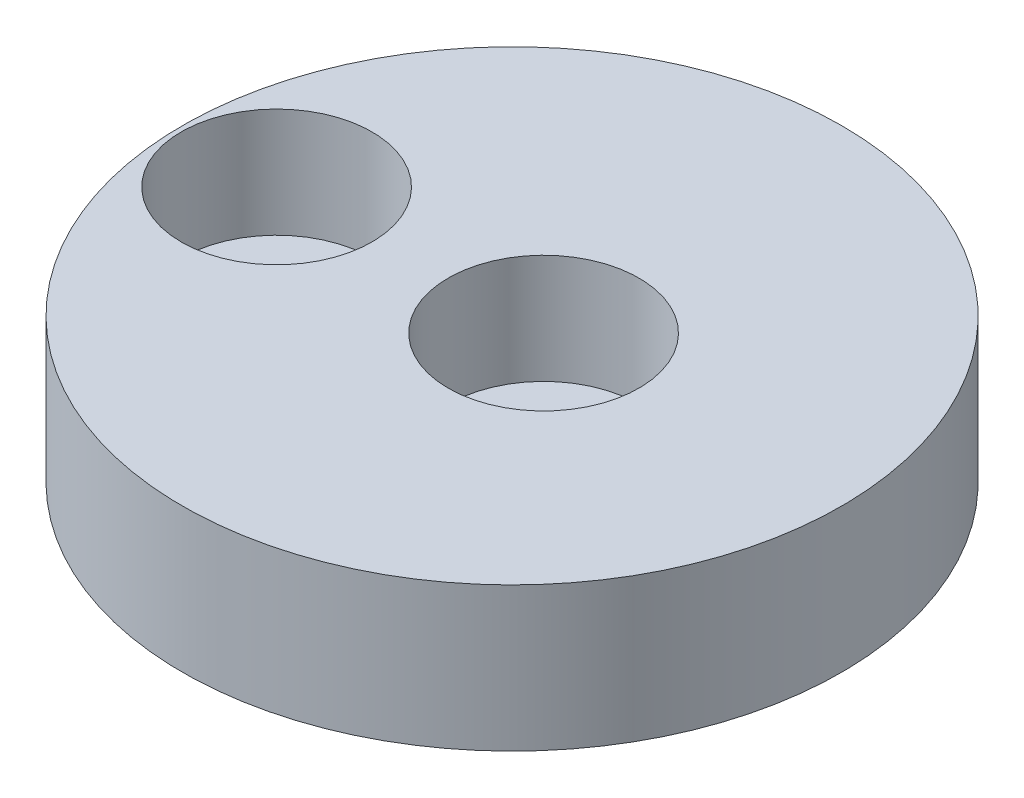
ISO-10303-21;
HEADER;
FILE_DESCRIPTION(('STEP AP214'),'2;1');
FILE_NAME('part.step','',(''),(''),'','','');
FILE_SCHEMA(('AUTOMOTIVE_DESIGN { 1 0 10303 214 1 1 1 1 }'));
ENDSEC;
DATA;
#1=APPLICATION_CONTEXT('core data for automotive mechanical design processes');
#2=APPLICATION_PROTOCOL_DEFINITION('international standard','automotive_design',2000,#1);
#3=PRODUCT_CONTEXT('',#1,'mechanical');
#4=PRODUCT('Part','Part','',(#3));
#5=PRODUCT_RELATED_PRODUCT_CATEGORY('part','',(#4));
#6=PRODUCT_DEFINITION_FORMATION('','',#4);
#7=PRODUCT_DEFINITION_CONTEXT('part definition',#1,'design');
#8=PRODUCT_DEFINITION('design','',#6,#7);
#9=PRODUCT_DEFINITION_SHAPE('','',#8);
#10=(LENGTH_UNIT() NAMED_UNIT(*) SI_UNIT(.MILLI.,.METRE.));
#11=(NAMED_UNIT(*) PLANE_ANGLE_UNIT() SI_UNIT($,.RADIAN.));
#12=(NAMED_UNIT(*) SI_UNIT($,.STERADIAN.) SOLID_ANGLE_UNIT());
#13=UNCERTAINTY_MEASURE_WITH_UNIT(LENGTH_MEASURE(1.E-05),#10,'distance_accuracy_value','');
#14=(GEOMETRIC_REPRESENTATION_CONTEXT(3) GLOBAL_UNCERTAINTY_ASSIGNED_CONTEXT((#13)) GLOBAL_UNIT_ASSIGNED_CONTEXT((#10,
#11,#12)) REPRESENTATION_CONTEXT('',''));
#15=CARTESIAN_POINT('',(0.,0.,0.));
#16=DIRECTION('',(0.,0.,1.));
#17=DIRECTION('',(1.,0.,0.));
#18=AXIS2_PLACEMENT_3D('',#15,#16,#17);
#19=CARTESIAN_POINT('',(1.77051469042344,0.,-0.0468468570589131));
#20=DIRECTION('',(0.,-1.,0.));
#21=DIRECTION('',(0.,0.,-1.));
#22=AXIS2_PLACEMENT_3D('',#19,#20,#21);
#23=CYLINDRICAL_SURFACE('',#22,2.99999999999997);
#24=CARTESIAN_POINT('',(1.77051469042344,0.,-0.0468468570589131));
#25=DIRECTION('',(0.,1.,0.));
#26=DIRECTION('',(0.,0.,1.));
#27=AXIS2_PLACEMENT_3D('',#24,#25,#26);
#28=CIRCLE('',#27,2.99999999999997);
#29=CARTESIAN_POINT('',(1.77051469042344,0.,2.95315314294105));
#30=VERTEX_POINT('',#29);
#31=EDGE_CURVE('E64',#30,#30,#28,.F.);
#32=ORIENTED_EDGE('',*,*,#31,.T.);
#33=EDGE_LOOP('',(#32));
#34=FACE_BOUND('',#33,.T.);
#35=CARTESIAN_POINT('',(1.77051469042344,2.,-0.0468468570589131));
#36=DIRECTION('',(0.,1.,0.));
#37=DIRECTION('',(0.,0.,1.));
#38=AXIS2_PLACEMENT_3D('',#35,#36,#37);
#39=CIRCLE('',#38,2.99999999999997);
#40=CARTESIAN_POINT('',(1.77051469042344,2.,2.95315314294105));
#41=VERTEX_POINT('',#40);
#42=EDGE_CURVE('E47',#41,#41,#39,.T.);
#43=ORIENTED_EDGE('',*,*,#42,.T.);
#44=EDGE_LOOP('',(#43));
#45=FACE_BOUND('',#44,.T.);
#46=ADVANCED_FACE('F43',(#34,#45),#23,.F.);
#47=CARTESIAN_POINT('',(-13.2242372936018,0.,0.349906136086986));
#48=DIRECTION('',(0.,-1.,0.));
#49=DIRECTION('',(0.,0.,-1.));
#50=AXIS2_PLACEMENT_3D('',#47,#48,#49);
#51=CYLINDRICAL_SURFACE('',#50,2.99999999999997);
#52=CARTESIAN_POINT('',(-13.2242372936018,0.,0.349906136086986));
#53=DIRECTION('',(0.,1.,0.));
#54=DIRECTION('',(0.,0.,1.));
#55=AXIS2_PLACEMENT_3D('',#52,#53,#54);
#56=CIRCLE('',#55,2.99999999999997);
#57=CARTESIAN_POINT('',(-13.2242372936018,0.,3.34990613608695));
#58=VERTEX_POINT('',#57);
#59=EDGE_CURVE('E58',#58,#58,#56,.F.);
#60=ORIENTED_EDGE('',*,*,#59,.T.);
#61=EDGE_LOOP('',(#60));
#62=FACE_BOUND('',#61,.T.);
#63=CARTESIAN_POINT('',(-13.2242372936018,2.,0.349906136086986));
#64=DIRECTION('',(0.,1.,0.));
#65=DIRECTION('',(0.,0.,1.));
#66=AXIS2_PLACEMENT_3D('',#63,#64,#65);
#67=CIRCLE('',#66,2.99999999999997);
#68=CARTESIAN_POINT('',(-13.2242372936018,2.,3.34990613608695));
#69=VERTEX_POINT('',#68);
#70=EDGE_CURVE('E70',#69,#69,#67,.T.);
#71=ORIENTED_EDGE('',*,*,#70,.T.);
#72=EDGE_LOOP('',(#71));
#73=FACE_BOUND('',#72,.T.);
#74=ADVANCED_FACE('F113',(#62,#73),#51,.F.);
#75=CARTESIAN_POINT('',(0.,8.3,0.));
#76=DIRECTION('',(0.,-1.,0.));
#77=DIRECTION('',(0.,0.,-1.));
#78=AXIS2_PLACEMENT_3D('',#75,#76,#77);
#79=CYLINDRICAL_SURFACE('',#78,19.);
#80=CARTESIAN_POINT('',(0.,8.3,0.));
#81=DIRECTION('',(0.,1.,0.));
#82=DIRECTION('',(0.,0.,1.));
#83=AXIS2_PLACEMENT_3D('',#80,#81,#82);
#84=CIRCLE('',#83,19.);
#85=CARTESIAN_POINT('',(0.,8.3,-19.));
#86=VERTEX_POINT('',#85);
#87=EDGE_CURVE('E10',#86,#86,#84,.T.);
#88=CARTESIAN_POINT('',(0.,0.,0.));
#89=DIRECTION('',(0.,1.,0.));
#90=DIRECTION('',(0.,0.,1.));
#91=AXIS2_PLACEMENT_3D('',#88,#89,#90);
#92=CIRCLE('',#91,19.);
#93=CARTESIAN_POINT('',(0.,0.,-19.));
#94=VERTEX_POINT('',#93);
#95=EDGE_CURVE('E52',#94,#94,#92,.T.);
#96=CARTESIAN_POINT('',(0.,8.3,-19.));
#97=CARTESIAN_POINT('',(0.,8.21354166666667,-19.));
#98=CARTESIAN_POINT('',(0.,8.12708333333333,-19.));
#99=CARTESIAN_POINT('',(0.,7.95416666666667,-19.));
#100=CARTESIAN_POINT('',(0.,7.86770833333333,-19.));
#101=CARTESIAN_POINT('',(0.,7.69479166666667,-19.));
#102=CARTESIAN_POINT('',(0.,7.60833333333333,-19.));
#103=CARTESIAN_POINT('',(0.,7.43541666666667,-19.));
#104=CARTESIAN_POINT('',(0.,7.34895833333333,-19.));
#105=CARTESIAN_POINT('',(0.,7.17604166666667,-19.));
#106=CARTESIAN_POINT('',(0.,7.08958333333333,-19.));
#107=CARTESIAN_POINT('',(0.,6.91666666666667,-19.));
#108=CARTESIAN_POINT('',(0.,6.83020833333333,-19.));
#109=CARTESIAN_POINT('',(0.,6.65729166666667,-19.));
#110=CARTESIAN_POINT('',(0.,6.57083333333333,-19.));
#111=CARTESIAN_POINT('',(0.,6.39791666666667,-19.));
#112=CARTESIAN_POINT('',(0.,6.31145833333333,-19.));
#113=CARTESIAN_POINT('',(0.,6.13854166666667,-19.));
#114=CARTESIAN_POINT('',(0.,6.05208333333333,-19.));
#115=CARTESIAN_POINT('',(0.,5.87916666666667,-19.));
#116=CARTESIAN_POINT('',(0.,5.79270833333333,-19.));
#117=CARTESIAN_POINT('',(0.,5.61979166666667,-19.));
#118=CARTESIAN_POINT('',(0.,5.53333333333333,-19.));
#119=CARTESIAN_POINT('',(0.,5.36041666666666,-19.));
#120=CARTESIAN_POINT('',(0.,5.27395833333333,-19.));
#121=CARTESIAN_POINT('',(0.,5.10104166666667,-19.));
#122=CARTESIAN_POINT('',(0.,5.01458333333333,-19.));
#123=CARTESIAN_POINT('',(0.,4.84166666666667,-19.));
#124=CARTESIAN_POINT('',(0.,4.75520833333333,-19.));
#125=CARTESIAN_POINT('',(0.,4.58229166666667,-19.));
#126=CARTESIAN_POINT('',(0.,4.49583333333333,-19.));
#127=CARTESIAN_POINT('',(0.,4.32291666666667,-19.));
#128=CARTESIAN_POINT('',(0.,4.23645833333333,-19.));
#129=CARTESIAN_POINT('',(0.,4.06354166666667,-19.));
#130=CARTESIAN_POINT('',(0.,3.97708333333333,-19.));
#131=CARTESIAN_POINT('',(0.,3.80416666666667,-19.));
#132=CARTESIAN_POINT('',(0.,3.71770833333333,-19.));
#133=CARTESIAN_POINT('',(0.,3.54479166666667,-19.));
#134=CARTESIAN_POINT('',(0.,3.45833333333333,-19.));
#135=CARTESIAN_POINT('',(0.,3.28541666666667,-19.));
#136=CARTESIAN_POINT('',(0.,3.19895833333333,-19.));
#137=CARTESIAN_POINT('',(0.,3.02604166666667,-19.));
#138=CARTESIAN_POINT('',(0.,2.93958333333333,-19.));
#139=CARTESIAN_POINT('',(0.,2.76666666666667,-19.));
#140=CARTESIAN_POINT('',(0.,2.68020833333333,-19.));
#141=CARTESIAN_POINT('',(0.,2.50729166666667,-19.));
#142=CARTESIAN_POINT('',(0.,2.42083333333333,-19.));
#143=CARTESIAN_POINT('',(0.,2.24791666666667,-19.));
#144=CARTESIAN_POINT('',(0.,2.16145833333333,-19.));
#145=CARTESIAN_POINT('',(0.,1.98854166666667,-19.));
#146=CARTESIAN_POINT('',(0.,1.90208333333333,-19.));
#147=CARTESIAN_POINT('',(0.,1.72916666666667,-19.));
#148=CARTESIAN_POINT('',(0.,1.64270833333333,-19.));
#149=CARTESIAN_POINT('',(0.,1.46979166666667,-19.));
#150=CARTESIAN_POINT('',(0.,1.38333333333333,-19.));
#151=CARTESIAN_POINT('',(0.,1.21041666666667,-19.));
#152=CARTESIAN_POINT('',(0.,1.12395833333333,-19.));
#153=CARTESIAN_POINT('',(0.,0.951041666666665,-19.));
#154=CARTESIAN_POINT('',(0.,0.864583333333332,-19.));
#155=CARTESIAN_POINT('',(0.,0.691666666666665,-19.));
#156=CARTESIAN_POINT('',(0.,0.605208333333332,-19.));
#157=CARTESIAN_POINT('',(0.,0.432291666666665,-19.));
#158=CARTESIAN_POINT('',(0.,0.345833333333332,-19.));
#159=CARTESIAN_POINT('',(0.,0.172916666666666,-19.));
#160=CARTESIAN_POINT('',(0.,0.086458333333333,-19.));
#161=CARTESIAN_POINT('',(0.,0.,-19.));
#162=B_SPLINE_CURVE_WITH_KNOTS('',3,(#96,#97,#98,#99,#100,#101,#102,#103,#104,#105,#106,#107,
#108,#109,#110,#111,#112,#113,#114,#115,#116,#117,#118,#119,#120,#121,#122,#123,#124,#125,#126,
#127,#128,#129,#130,#131,#132,#133,#134,#135,#136,#137,#138,#139,#140,#141,#142,#143,#144,#145,
#146,#147,#148,#149,#150,#151,#152,#153,#154,#155,#156,#157,#158,#159,#160,#161),.UNSPECIFIED.,
.F.,.F.,(4,2,2,2,2,2,2,2,2,2,2,2,2,2,2,2,2,2,2,2,2,2,2,2,2,2,2,2,2,2,2,2,4),(0.,
0.259375000000001,0.518750000000001,0.778125000000001,1.0375,1.296875,1.55625,1.815625,2.075,
2.334375,2.59375,2.853125,3.1125,3.371875,3.63125,3.890625,4.15,4.409375,4.66875,4.928125,
5.1875,5.446875,5.70625,5.965625,6.225,6.484375,6.74375,7.003125,7.2625,7.521875,7.78125,
8.040625,8.3),.UNSPECIFIED.);
#163=EDGE_CURVE('BSEAM45',#86,#94,#162,.T.);
#164=ORIENTED_EDGE('',*,*,#87,.F.);
#165=ORIENTED_EDGE('',*,*,#95,.T.);
#166=ORIENTED_EDGE('',*,*,#163,.T.);
#167=ORIENTED_EDGE('',*,*,#163,.F.);
#168=EDGE_LOOP('',(#164,#166,#165,#167));
#169=FACE_BOUND('',#168,.T.);
#170=ADVANCED_FACE('F45',(#169),#79,.T.);
#171=CARTESIAN_POINT('',(0.,8.3,0.));
#172=DIRECTION('',(0.,1.,0.));
#173=DIRECTION('',(0.,0.,1.));
#174=AXIS2_PLACEMENT_3D('',#171,#172,#173);
#175=PLANE('',#174);
#176=CARTESIAN_POINT('',(-13.2242372936018,8.3,0.349906136086986));
#177=DIRECTION('',(0.,1.,0.));
#178=DIRECTION('',(0.,0.,1.));
#179=AXIS2_PLACEMENT_3D('',#176,#177,#178);
#180=CIRCLE('',#179,5.5);
#181=CARTESIAN_POINT('',(-13.2242372936018,8.3,5.84990613608699));
#182=VERTEX_POINT('',#181);
#183=EDGE_CURVE('E80',#182,#182,#180,.T.);
#184=ORIENTED_EDGE('',*,*,#183,.F.);
#185=EDGE_LOOP('',(#184));
#186=FACE_BOUND('',#185,.T.);
#187=CARTESIAN_POINT('',(1.77051469042344,8.3,-0.0468468570589131));
#188=DIRECTION('',(0.,1.,0.));
#189=DIRECTION('',(0.,0.,1.));
#190=AXIS2_PLACEMENT_3D('',#187,#188,#189);
#191=CIRCLE('',#190,5.5);
#192=CARTESIAN_POINT('',(1.77051469042344,8.3,5.45315314294109));
#193=VERTEX_POINT('',#192);
#194=EDGE_CURVE('E86',#193,#193,#191,.T.);
#195=ORIENTED_EDGE('',*,*,#194,.F.);
#196=EDGE_LOOP('',(#195));
#197=FACE_BOUND('',#196,.T.);
#198=ORIENTED_EDGE('',*,*,#87,.T.);
#199=EDGE_LOOP('',(#198));
#200=FACE_BOUND('',#199,.T.);
#201=ADVANCED_FACE('F124',(#186,#197,#200),#175,.T.);
#202=CARTESIAN_POINT('',(0.,0.,0.));
#203=DIRECTION('',(0.,1.,0.));
#204=DIRECTION('',(0.,0.,1.));
#205=AXIS2_PLACEMENT_3D('',#202,#203,#204);
#206=PLANE('',#205);
#207=ORIENTED_EDGE('',*,*,#59,.F.);
#208=EDGE_LOOP('',(#207));
#209=FACE_BOUND('',#208,.T.);
#210=ORIENTED_EDGE('',*,*,#31,.F.);
#211=EDGE_LOOP('',(#210));
#212=FACE_BOUND('',#211,.T.);
#213=ORIENTED_EDGE('',*,*,#95,.F.);
#214=EDGE_LOOP('',(#213));
#215=FACE_BOUND('',#214,.T.);
#216=ADVANCED_FACE('F126',(#209,#212,#215),#206,.F.);
#217=CARTESIAN_POINT('',(-13.2242372936018,2.,0.349906136086986));
#218=DIRECTION('',(0.,1.,0.));
#219=DIRECTION('',(0.,0.,1.));
#220=AXIS2_PLACEMENT_3D('',#217,#218,#219);
#221=CYLINDRICAL_SURFACE('',#220,5.5);
#222=CARTESIAN_POINT('',(-13.2242372936018,2.,0.349906136086986));
#223=DIRECTION('',(0.,1.,0.));
#224=DIRECTION('',(0.,0.,1.));
#225=AXIS2_PLACEMENT_3D('',#222,#223,#224);
#226=CIRCLE('',#225,5.5);
#227=CARTESIAN_POINT('',(-13.2242372936018,2.,5.84990613608699));
#228=VERTEX_POINT('',#227);
#229=EDGE_CURVE('E73',#228,#228,#226,.T.);
#230=ORIENTED_EDGE('',*,*,#229,.F.);
#231=EDGE_LOOP('',(#230));
#232=FACE_BOUND('',#231,.T.);
#233=ORIENTED_EDGE('',*,*,#183,.T.);
#234=EDGE_LOOP('',(#233));
#235=FACE_BOUND('',#234,.T.);
#236=ADVANCED_FACE('F108',(#232,#235),#221,.F.);
#237=CARTESIAN_POINT('',(-13.2242372936018,2.,0.349906136086986));
#238=DIRECTION('',(0.,1.,0.));
#239=DIRECTION('',(0.,0.,1.));
#240=AXIS2_PLACEMENT_3D('',#237,#238,#239);
#241=PLANE('',#240);
#242=ORIENTED_EDGE('',*,*,#70,.F.);
#243=EDGE_LOOP('',(#242));
#244=FACE_BOUND('',#243,.T.);
#245=ORIENTED_EDGE('',*,*,#229,.T.);
#246=EDGE_LOOP('',(#245));
#247=FACE_BOUND('',#246,.T.);
#248=ADVANCED_FACE('F100',(#244,#247),#241,.T.);
#249=CARTESIAN_POINT('',(1.77051469042344,2.,-0.0468468570589131));
#250=DIRECTION('',(0.,1.,0.));
#251=DIRECTION('',(0.,0.,1.));
#252=AXIS2_PLACEMENT_3D('',#249,#250,#251);
#253=CYLINDRICAL_SURFACE('',#252,5.5);
#254=CARTESIAN_POINT('',(1.77051469042344,2.,-0.0468468570589131));
#255=DIRECTION('',(0.,1.,0.));
#256=DIRECTION('',(0.,0.,1.));
#257=AXIS2_PLACEMENT_3D('',#254,#255,#256);
#258=CIRCLE('',#257,5.5);
#259=CARTESIAN_POINT('',(1.77051469042344,2.,5.45315314294109));
#260=VERTEX_POINT('',#259);
#261=EDGE_CURVE('E61',#260,#260,#258,.T.);
#262=ORIENTED_EDGE('',*,*,#261,.F.);
#263=EDGE_LOOP('',(#262));
#264=FACE_BOUND('',#263,.T.);
#265=ORIENTED_EDGE('',*,*,#194,.T.);
#266=EDGE_LOOP('',(#265));
#267=FACE_BOUND('',#266,.T.);
#268=ADVANCED_FACE('F98',(#264,#267),#253,.F.);
#269=CARTESIAN_POINT('',(1.77051469042344,2.,-0.0468468570589131));
#270=DIRECTION('',(0.,1.,0.));
#271=DIRECTION('',(0.,0.,1.));
#272=AXIS2_PLACEMENT_3D('',#269,#270,#271);
#273=PLANE('',#272);
#274=ORIENTED_EDGE('',*,*,#42,.F.);
#275=EDGE_LOOP('',(#274));
#276=FACE_BOUND('',#275,.T.);
#277=ORIENTED_EDGE('',*,*,#261,.T.);
#278=EDGE_LOOP('',(#277));
#279=FACE_BOUND('',#278,.T.);
#280=ADVANCED_FACE('F96',(#276,#279),#273,.T.);
#281=CLOSED_SHELL('',(#46,#74,#170,#201,#216,#236,#248,#268,#280));
#282=MANIFOLD_SOLID_BREP('B2',#281);
#283=ADVANCED_BREP_SHAPE_REPRESENTATION('',(#18,#282),#14);
#284=SHAPE_DEFINITION_REPRESENTATION(#9,#283);
ENDSEC;
END-ISO-10303-21;
